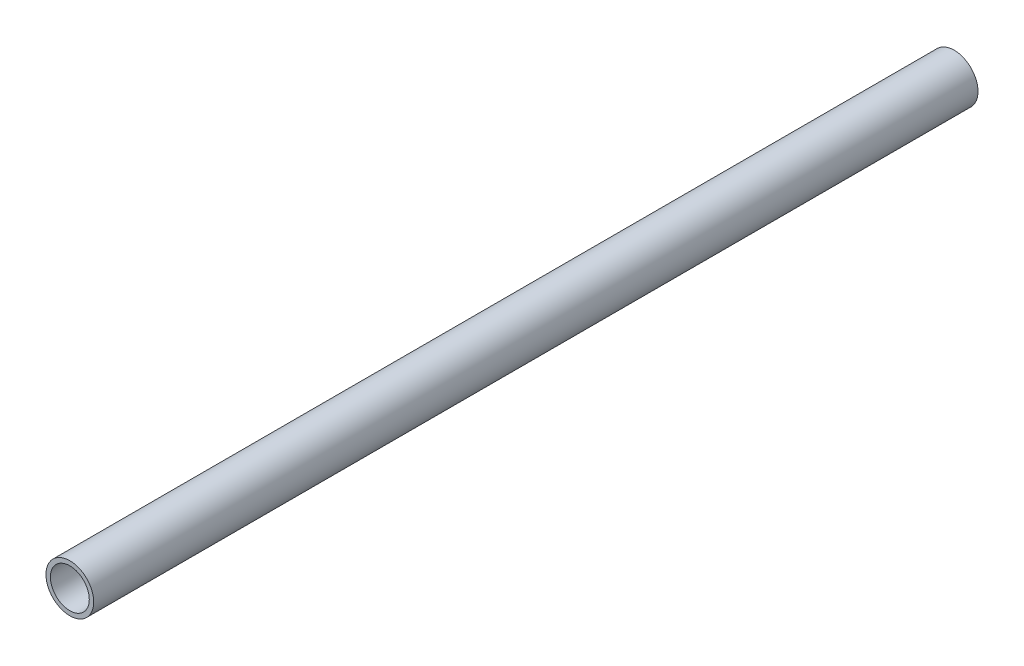
ISO-10303-21;
HEADER;
FILE_DESCRIPTION(('STEP AP214'),'2;1');
FILE_NAME('part.step','',(''),(''),'','','');
FILE_SCHEMA(('AUTOMOTIVE_DESIGN { 1 0 10303 214 1 1 1 1 }'));
ENDSEC;
DATA;
#1=APPLICATION_CONTEXT('core data for automotive mechanical design processes');
#2=APPLICATION_PROTOCOL_DEFINITION('international standard','automotive_design',2000,#1);
#3=PRODUCT_CONTEXT('',#1,'mechanical');
#4=PRODUCT('Part','Part','',(#3));
#5=PRODUCT_RELATED_PRODUCT_CATEGORY('part','',(#4));
#6=PRODUCT_DEFINITION_FORMATION('','',#4);
#7=PRODUCT_DEFINITION_CONTEXT('part definition',#1,'design');
#8=PRODUCT_DEFINITION('design','',#6,#7);
#9=PRODUCT_DEFINITION_SHAPE('','',#8);
#10=(LENGTH_UNIT() NAMED_UNIT(*) SI_UNIT(.MILLI.,.METRE.));
#11=(NAMED_UNIT(*) PLANE_ANGLE_UNIT() SI_UNIT($,.RADIAN.));
#12=(NAMED_UNIT(*) SI_UNIT($,.STERADIAN.) SOLID_ANGLE_UNIT());
#13=UNCERTAINTY_MEASURE_WITH_UNIT(LENGTH_MEASURE(1.E-05),#10,'distance_accuracy_value','');
#14=(GEOMETRIC_REPRESENTATION_CONTEXT(3) GLOBAL_UNCERTAINTY_ASSIGNED_CONTEXT((#13)) GLOBAL_UNIT_ASSIGNED_CONTEXT((#10,
#11,#12)) REPRESENTATION_CONTEXT('',''));
#15=CARTESIAN_POINT('',(0.,0.,0.));
#16=DIRECTION('',(0.,0.,1.));
#17=DIRECTION('',(1.,0.,0.));
#18=AXIS2_PLACEMENT_3D('',#15,#16,#17);
#19=CARTESIAN_POINT('',(0.,0.,150.));
#20=DIRECTION('',(0.,0.,1.));
#21=DIRECTION('',(1.,0.,0.));
#22=AXIS2_PLACEMENT_3D('',#19,#20,#21);
#23=PLANE('',#22);
#24=CARTESIAN_POINT('',(0.,0.,150.));
#25=DIRECTION('',(0.,0.,1.));
#26=DIRECTION('',(1.,0.,0.));
#27=AXIS2_PLACEMENT_3D('',#24,#25,#26);
#28=CIRCLE('',#27,8.1);
#29=CARTESIAN_POINT('',(8.1,0.,150.));
#30=VERTEX_POINT('',#29);
#31=EDGE_CURVE('E10',#30,#30,#28,.T.);
#32=ORIENTED_EDGE('',*,*,#31,.T.);
#33=EDGE_LOOP('',(#32));
#34=FACE_BOUND('',#33,.T.);
#35=CARTESIAN_POINT('',(0.,0.,150.));
#36=DIRECTION('',(0.,0.,1.));
#37=DIRECTION('',(1.,0.,0.));
#38=AXIS2_PLACEMENT_3D('',#35,#36,#37);
#39=CIRCLE('',#38,6.6);
#40=CARTESIAN_POINT('',(6.6,0.,150.));
#41=VERTEX_POINT('',#40);
#42=EDGE_CURVE('E52',#41,#41,#39,.T.);
#43=ORIENTED_EDGE('',*,*,#42,.F.);
#44=EDGE_LOOP('',(#43));
#45=FACE_BOUND('',#44,.T.);
#46=ADVANCED_FACE('F39',(#34,#45),#23,.T.);
#47=CARTESIAN_POINT('',(0.,0.,-150.));
#48=DIRECTION('',(0.,0.,1.));
#49=DIRECTION('',(1.,0.,0.));
#50=AXIS2_PLACEMENT_3D('',#47,#48,#49);
#51=PLANE('',#50);
#52=CARTESIAN_POINT('',(0.,0.,-150.));
#53=DIRECTION('',(0.,0.,1.));
#54=DIRECTION('',(1.,0.,0.));
#55=AXIS2_PLACEMENT_3D('',#52,#53,#54);
#56=CIRCLE('',#55,8.1);
#57=CARTESIAN_POINT('',(8.1,0.,-150.));
#58=VERTEX_POINT('',#57);
#59=EDGE_CURVE('E43',#58,#58,#56,.T.);
#60=ORIENTED_EDGE('',*,*,#59,.F.);
#61=EDGE_LOOP('',(#60));
#62=FACE_BOUND('',#61,.T.);
#63=CARTESIAN_POINT('',(0.,0.,-150.));
#64=DIRECTION('',(0.,0.,1.));
#65=DIRECTION('',(1.,0.,0.));
#66=AXIS2_PLACEMENT_3D('',#63,#64,#65);
#67=CIRCLE('',#66,6.6);
#68=CARTESIAN_POINT('',(6.6,0.,-150.));
#69=VERTEX_POINT('',#68);
#70=EDGE_CURVE('E54',#69,#69,#67,.T.);
#71=ORIENTED_EDGE('',*,*,#70,.T.);
#72=EDGE_LOOP('',(#71));
#73=FACE_BOUND('',#72,.T.);
#74=ADVANCED_FACE('F66',(#62,#73),#51,.F.);
#75=CARTESIAN_POINT('',(0.,0.,150.));
#76=DIRECTION('',(0.,0.,-1.));
#77=DIRECTION('',(-1.,0.,0.));
#78=AXIS2_PLACEMENT_3D('',#75,#76,#77);
#79=CYLINDRICAL_SURFACE('',#78,8.1);
#80=ORIENTED_EDGE('',*,*,#31,.F.);
#81=EDGE_LOOP('',(#80));
#82=FACE_BOUND('',#81,.T.);
#83=ORIENTED_EDGE('',*,*,#59,.T.);
#84=EDGE_LOOP('',(#83));
#85=FACE_BOUND('',#84,.T.);
#86=ADVANCED_FACE('F41',(#82,#85),#79,.T.);
#87=CARTESIAN_POINT('',(0.,0.,150.));
#88=DIRECTION('',(0.,0.,-1.));
#89=DIRECTION('',(-1.,0.,0.));
#90=AXIS2_PLACEMENT_3D('',#87,#88,#89);
#91=CYLINDRICAL_SURFACE('',#90,6.6);
#92=ORIENTED_EDGE('',*,*,#42,.T.);
#93=EDGE_LOOP('',(#92));
#94=FACE_BOUND('',#93,.T.);
#95=ORIENTED_EDGE('',*,*,#70,.F.);
#96=EDGE_LOOP('',(#95));
#97=FACE_BOUND('',#96,.T.);
#98=ADVANCED_FACE('F62',(#94,#97),#91,.F.);
#99=CLOSED_SHELL('',(#46,#74,#86,#98));
#100=MANIFOLD_SOLID_BREP('B2',#99);
#101=ADVANCED_BREP_SHAPE_REPRESENTATION('',(#18,#100),#14);
#102=SHAPE_DEFINITION_REPRESENTATION(#9,#101);
ENDSEC;
END-ISO-10303-21;
